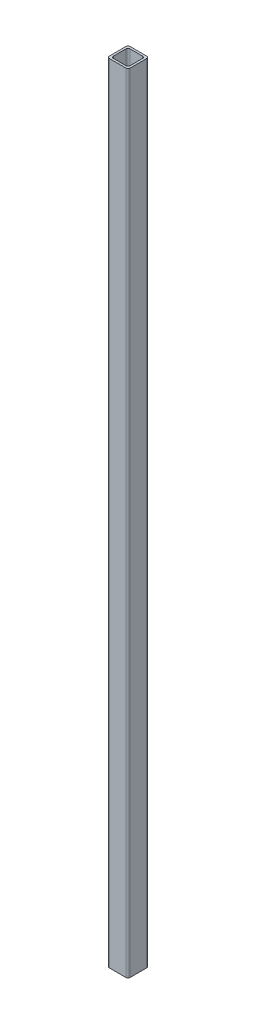
ISO-10303-21;
HEADER;
FILE_DESCRIPTION(('STEP AP214'),'2;1');
FILE_NAME('part.step','',(''),(''),'','','');
FILE_SCHEMA(('AUTOMOTIVE_DESIGN { 1 0 10303 214 1 1 1 1 }'));
ENDSEC;
DATA;
#1=APPLICATION_CONTEXT('core data for automotive mechanical design processes');
#2=APPLICATION_PROTOCOL_DEFINITION('international standard','automotive_design',2000,#1);
#3=PRODUCT_CONTEXT('',#1,'mechanical');
#4=PRODUCT('Part','Part','',(#3));
#5=PRODUCT_RELATED_PRODUCT_CATEGORY('part','',(#4));
#6=PRODUCT_DEFINITION_FORMATION('','',#4);
#7=PRODUCT_DEFINITION_CONTEXT('part definition',#1,'design');
#8=PRODUCT_DEFINITION('design','',#6,#7);
#9=PRODUCT_DEFINITION_SHAPE('','',#8);
#10=(LENGTH_UNIT() NAMED_UNIT(*) SI_UNIT(.MILLI.,.METRE.));
#11=(NAMED_UNIT(*) PLANE_ANGLE_UNIT() SI_UNIT($,.RADIAN.));
#12=(NAMED_UNIT(*) SI_UNIT($,.STERADIAN.) SOLID_ANGLE_UNIT());
#13=UNCERTAINTY_MEASURE_WITH_UNIT(LENGTH_MEASURE(1.E-05),#10,'distance_accuracy_value','');
#14=(GEOMETRIC_REPRESENTATION_CONTEXT(3) GLOBAL_UNCERTAINTY_ASSIGNED_CONTEXT((#13)) GLOBAL_UNIT_ASSIGNED_CONTEXT((#10,
#11,#12)) REPRESENTATION_CONTEXT('',''));
#15=CARTESIAN_POINT('',(0.,0.,0.));
#16=DIRECTION('',(0.,0.,1.));
#17=DIRECTION('',(1.,0.,0.));
#18=AXIS2_PLACEMENT_3D('',#15,#16,#17);
#19=CARTESIAN_POINT('',(-43.8870390225277,-2175.91873492757,2.54345588572199));
#20=DIRECTION('',(0.,-1.,0.));
#21=DIRECTION('',(0.,0.,-1.));
#22=AXIS2_PLACEMENT_3D('',#19,#20,#21);
#23=PLANE('',#22);
#24=DIRECTION('',(1.,0.,0.));
#25=VECTOR('',#24,1.);
#26=CARTESIAN_POINT('',(-49.2861215913166,-2175.91873492757,1.54345588572199));
#27=LINE('',#26,#25);
#28=CARTESIAN_POINT('',(-51.8870390225277,-2175.91873492757,1.54345588572199));
#29=VERTEX_POINT('',#28);
#30=CARTESIAN_POINT('',(-43.8870390225277,-2175.91873492757,1.54345588572199));
#31=VERTEX_POINT('',#30);
#32=EDGE_CURVE('E124',#29,#31,#27,.T.);
#33=ORIENTED_EDGE('',*,*,#32,.F.);
#34=CARTESIAN_POINT('',(-51.8870390225277,-2175.91873492757,2.54345588572199));
#35=DIRECTION('',(0.,-1.,0.));
#36=DIRECTION('',(0.,0.,-1.));
#37=AXIS2_PLACEMENT_3D('',#34,#35,#36);
#38=CIRCLE('',#37,1.);
#39=CARTESIAN_POINT('',(-52.8870390225277,-2175.91873492757,2.54345588572199));
#40=VERTEX_POINT('',#39);
#41=EDGE_CURVE('E145',#40,#29,#38,.T.);
#42=ORIENTED_EDGE('',*,*,#41,.F.);
#43=DIRECTION('',(0.,0.,-1.));
#44=VECTOR('',#43,1.);
#45=CARTESIAN_POINT('',(-52.8870390225277,-2175.91873492757,-2.53911292161383));
#46=LINE('',#45,#44);
#47=CARTESIAN_POINT('',(-52.8870390225277,-2175.91873492757,10.543455885722));
#48=VERTEX_POINT('',#47);
#49=EDGE_CURVE('E142',#48,#40,#46,.T.);
#50=ORIENTED_EDGE('',*,*,#49,.F.);
#51=CARTESIAN_POINT('',(-51.8870390225277,-2175.91873492757,10.543455885722));
#52=DIRECTION('',(0.,-1.,0.));
#53=DIRECTION('',(0.,0.,-1.));
#54=AXIS2_PLACEMENT_3D('',#51,#52,#53);
#55=CIRCLE('',#54,1.);
#56=CARTESIAN_POINT('',(-51.8870390225277,-2175.91873492757,11.543455885722));
#57=VERTEX_POINT('',#56);
#58=EDGE_CURVE('E139',#57,#48,#55,.T.);
#59=ORIENTED_EDGE('',*,*,#58,.F.);
#60=DIRECTION('',(-1.,0.,0.));
#61=VECTOR('',#60,1.);
#62=CARTESIAN_POINT('',(-49.2861215913166,-2175.91873492757,11.543455885722));
#63=LINE('',#62,#61);
#64=CARTESIAN_POINT('',(-43.8870390225277,-2175.91873492757,11.543455885722));
#65=VERTEX_POINT('',#64);
#66=EDGE_CURVE('E136',#65,#57,#63,.T.);
#67=ORIENTED_EDGE('',*,*,#66,.F.);
#68=CARTESIAN_POINT('',(-43.8870390225277,-2175.91873492757,10.543455885722));
#69=DIRECTION('',(0.,-1.,0.));
#70=DIRECTION('',(0.,0.,-1.));
#71=AXIS2_PLACEMENT_3D('',#68,#69,#70);
#72=CIRCLE('',#71,1.);
#73=CARTESIAN_POINT('',(-42.8870390225277,-2175.91873492757,10.543455885722));
#74=VERTEX_POINT('',#73);
#75=EDGE_CURVE('E133',#74,#65,#72,.T.);
#76=ORIENTED_EDGE('',*,*,#75,.F.);
#77=DIRECTION('',(0.,0.,1.));
#78=VECTOR('',#77,1.);
#79=CARTESIAN_POINT('',(-42.8870390225277,-2175.91873492757,-2.53911292161383));
#80=LINE('',#79,#78);
#81=CARTESIAN_POINT('',(-42.8870390225277,-2175.91873492757,2.54345588572199));
#82=VERTEX_POINT('',#81);
#83=EDGE_CURVE('E130',#82,#74,#80,.T.);
#84=ORIENTED_EDGE('',*,*,#83,.F.);
#85=CARTESIAN_POINT('',(-43.8870390225277,-2175.91873492757,2.54345588572199));
#86=DIRECTION('',(0.,-1.,0.));
#87=DIRECTION('',(0.,0.,-1.));
#88=AXIS2_PLACEMENT_3D('',#85,#86,#87);
#89=CIRCLE('',#88,1.);
#90=EDGE_CURVE('E127',#31,#82,#89,.T.);
#91=ORIENTED_EDGE('',*,*,#90,.F.);
#92=EDGE_LOOP('',(#33,#42,#50,#59,#67,#76,#84,#91));
#93=FACE_BOUND('',#92,.T.);
#94=DIRECTION('',(1.,0.,0.));
#95=VECTOR('',#94,1.);
#96=CARTESIAN_POINT('',(-49.2861215913166,-2175.91873492757,2.54345588572199));
#97=LINE('',#96,#95);
#98=CARTESIAN_POINT('',(-50.8870390225277,-2175.91873492757,2.54345588572199));
#99=VERTEX_POINT('',#98);
#100=CARTESIAN_POINT('',(-44.8870390225277,-2175.91873492757,2.54345588572199));
#101=VERTEX_POINT('',#100);
#102=EDGE_CURVE('E262',#99,#101,#97,.T.);
#103=ORIENTED_EDGE('',*,*,#102,.T.);
#104=CARTESIAN_POINT('',(-44.8870390225277,-2175.91873492757,3.54345588572199));
#105=DIRECTION('',(0.,-1.,0.));
#106=DIRECTION('',(0.,0.,-1.));
#107=AXIS2_PLACEMENT_3D('',#104,#105,#106);
#108=CIRCLE('',#107,1.);
#109=CARTESIAN_POINT('',(-43.8870390225277,-2175.91873492757,3.543455885722));
#110=VERTEX_POINT('',#109);
#111=EDGE_CURVE('E322',#101,#110,#108,.T.);
#112=ORIENTED_EDGE('',*,*,#111,.T.);
#113=DIRECTION('',(0.,0.,1.));
#114=VECTOR('',#113,1.);
#115=CARTESIAN_POINT('',(-43.8870390225277,-2175.91873492757,-2.53911292161383));
#116=LINE('',#115,#114);
#117=CARTESIAN_POINT('',(-43.8870390225277,-2175.91873492757,9.54345588572198));
#118=VERTEX_POINT('',#117);
#119=EDGE_CURVE('E301',#110,#118,#116,.T.);
#120=ORIENTED_EDGE('',*,*,#119,.T.);
#121=CARTESIAN_POINT('',(-44.8870390225277,-2175.91873492757,9.54345588572199));
#122=DIRECTION('',(0.,-1.,0.));
#123=DIRECTION('',(0.,0.,-1.));
#124=AXIS2_PLACEMENT_3D('',#121,#122,#123);
#125=CIRCLE('',#124,1.);
#126=CARTESIAN_POINT('',(-44.8870390225277,-2175.91873492757,10.543455885722));
#127=VERTEX_POINT('',#126);
#128=EDGE_CURVE('E112',#118,#127,#125,.T.);
#129=ORIENTED_EDGE('',*,*,#128,.T.);
#130=DIRECTION('',(-1.,0.,0.));
#131=VECTOR('',#130,1.);
#132=CARTESIAN_POINT('',(-49.2861215913166,-2175.91873492757,10.543455885722));
#133=LINE('',#132,#131);
#134=CARTESIAN_POINT('',(-50.8870390225277,-2175.91873492757,10.543455885722));
#135=VERTEX_POINT('',#134);
#136=EDGE_CURVE('E289',#127,#135,#133,.T.);
#137=ORIENTED_EDGE('',*,*,#136,.T.);
#138=CARTESIAN_POINT('',(-50.8870390225277,-2175.91873492757,9.54345588572199));
#139=DIRECTION('',(0.,-1.,0.));
#140=DIRECTION('',(0.,0.,-1.));
#141=AXIS2_PLACEMENT_3D('',#138,#139,#140);
#142=CIRCLE('',#141,1.);
#143=CARTESIAN_POINT('',(-51.8870390225277,-2175.91873492757,9.54345588572198));
#144=VERTEX_POINT('',#143);
#145=EDGE_CURVE('E295',#135,#144,#142,.T.);
#146=ORIENTED_EDGE('',*,*,#145,.T.);
#147=DIRECTION('',(0.,0.,-1.));
#148=VECTOR('',#147,1.);
#149=CARTESIAN_POINT('',(-51.8870390225277,-2175.91873492757,-2.53911292161383));
#150=LINE('',#149,#148);
#151=CARTESIAN_POINT('',(-51.8870390225277,-2175.91873492757,3.543455885722));
#152=VERTEX_POINT('',#151);
#153=EDGE_CURVE('E298',#144,#152,#150,.T.);
#154=ORIENTED_EDGE('',*,*,#153,.T.);
#155=CARTESIAN_POINT('',(-50.8870390225277,-2175.91873492757,3.54345588572199));
#156=DIRECTION('',(0.,-1.,0.));
#157=DIRECTION('',(0.,0.,-1.));
#158=AXIS2_PLACEMENT_3D('',#155,#156,#157);
#159=CIRCLE('',#158,1.);
#160=EDGE_CURVE('E267',#152,#99,#159,.T.);
#161=ORIENTED_EDGE('',*,*,#160,.T.);
#162=EDGE_LOOP('',(#103,#112,#120,#129,#137,#146,#154,#161));
#163=FACE_BOUND('',#162,.T.);
#164=ADVANCED_FACE('F33',(#93,#163),#23,.F.);
#165=CARTESIAN_POINT('',(-49.2861215913166,-2569.3806597059,1.54345588572199));
#166=DIRECTION('',(0.,0.,1.));
#167=DIRECTION('',(1.,0.,0.));
#168=AXIS2_PLACEMENT_3D('',#165,#166,#167);
#169=PLANE('',#168);
#170=DIRECTION('',(0.,1.,0.));
#171=VECTOR('',#170,1.);
#172=CARTESIAN_POINT('',(-43.8870390225277,-2569.3806597059,1.54345588572199));
#173=LINE('',#172,#171);
#174=CARTESIAN_POINT('',(-43.8870390225111,-2555.23852408217,1.54345588571789));
#175=VERTEX_POINT('',#174);
#176=EDGE_CURVE('E169',#175,#31,#173,.T.);
#177=ORIENTED_EDGE('',*,*,#176,.F.);
#178=DIRECTION('',(-1.,0.,0.));
#179=VECTOR('',#178,1.);
#180=CARTESIAN_POINT('',(-49.2861215913166,-2555.23852408217,1.54345588572199));
#181=LINE('',#180,#179);
#182=CARTESIAN_POINT('',(-51.8870390225111,-2555.23852408217,1.54345588571784));
#183=VERTEX_POINT('',#182);
#184=EDGE_CURVE('E11',#175,#183,#181,.T.);
#185=ORIENTED_EDGE('',*,*,#184,.T.);
#186=DIRECTION('',(0.,1.,0.));
#187=VECTOR('',#186,1.);
#188=CARTESIAN_POINT('',(-51.8870390225277,-2569.3806597059,1.54345588572199));
#189=LINE('',#188,#187);
#190=EDGE_CURVE('E148',#183,#29,#189,.T.);
#191=ORIENTED_EDGE('',*,*,#190,.T.);
#192=ORIENTED_EDGE('',*,*,#32,.T.);
#193=EDGE_LOOP('',(#177,#185,#191,#192));
#194=FACE_BOUND('',#193,.T.);
#195=ADVANCED_FACE('F35',(#194),#169,.F.);
#196=CARTESIAN_POINT('',(-43.8870390225277,-2569.3806597059,2.54345588572199));
#197=DIRECTION('',(0.,1.,0.));
#198=DIRECTION('',(0.,0.,1.));
#199=AXIS2_PLACEMENT_3D('',#196,#197,#198);
#200=CYLINDRICAL_SURFACE('',#199,1.);
#201=DIRECTION('',(0.,1.,0.));
#202=VECTOR('',#201,1.);
#203=CARTESIAN_POINT('',(-42.8870390225277,-2569.3806597059,2.54345588572199));
#204=LINE('',#203,#202);
#205=CARTESIAN_POINT('',(-42.8870390225111,-2555.23852408217,2.54345588571789));
#206=VERTEX_POINT('',#205);
#207=EDGE_CURVE('E166',#206,#82,#204,.T.);
#208=ORIENTED_EDGE('',*,*,#207,.F.);
#209=CARTESIAN_POINT('',(-43.8870390225277,-2555.23852408217,2.54345588572199));
#210=DIRECTION('',(0.,1.,0.));
#211=DIRECTION('',(0.,0.,1.));
#212=AXIS2_PLACEMENT_3D('',#209,#210,#211);
#213=CIRCLE('',#212,1.);
#214=EDGE_CURVE('E42',#206,#175,#213,.T.);
#215=ORIENTED_EDGE('',*,*,#214,.T.);
#216=ORIENTED_EDGE('',*,*,#176,.T.);
#217=ORIENTED_EDGE('',*,*,#90,.T.);
#218=EDGE_LOOP('',(#208,#215,#216,#217));
#219=FACE_BOUND('',#218,.T.);
#220=ADVANCED_FACE('F203',(#219),#200,.T.);
#221=CARTESIAN_POINT('',(-42.8870390225277,-2569.3806597059,-2.53911292161383));
#222=DIRECTION('',(-1.,0.,0.));
#223=DIRECTION('',(0.,0.,1.));
#224=AXIS2_PLACEMENT_3D('',#221,#222,#223);
#225=PLANE('',#224);
#226=DIRECTION('',(0.,1.,0.));
#227=VECTOR('',#226,1.);
#228=CARTESIAN_POINT('',(-42.8870390225277,-2569.3806597059,10.543455885722));
#229=LINE('',#228,#227);
#230=CARTESIAN_POINT('',(-42.8870390225111,-2555.23852408217,10.5434558857179));
#231=VERTEX_POINT('',#230);
#232=EDGE_CURVE('E163',#231,#74,#229,.T.);
#233=ORIENTED_EDGE('',*,*,#232,.F.);
#234=DIRECTION('',(0.,0.,-1.));
#235=VECTOR('',#234,1.);
#236=CARTESIAN_POINT('',(-42.8870390225277,-2555.23852408217,-2.53911292161345));
#237=LINE('',#236,#235);
#238=EDGE_CURVE('E198',#231,#206,#237,.T.);
#239=ORIENTED_EDGE('',*,*,#238,.T.);
#240=ORIENTED_EDGE('',*,*,#207,.T.);
#241=ORIENTED_EDGE('',*,*,#83,.T.);
#242=EDGE_LOOP('',(#233,#239,#240,#241));
#243=FACE_BOUND('',#242,.T.);
#244=ADVANCED_FACE('F209',(#243),#225,.F.);
#245=CARTESIAN_POINT('',(-43.8870390225277,-2569.3806597059,10.543455885722));
#246=DIRECTION('',(0.,1.,0.));
#247=DIRECTION('',(0.,0.,1.));
#248=AXIS2_PLACEMENT_3D('',#245,#246,#247);
#249=CYLINDRICAL_SURFACE('',#248,1.);
#250=DIRECTION('',(0.,1.,0.));
#251=VECTOR('',#250,1.);
#252=CARTESIAN_POINT('',(-43.8870390225277,-2569.3806597059,11.543455885722));
#253=LINE('',#252,#251);
#254=CARTESIAN_POINT('',(-43.8870390225111,-2555.23852408217,11.5434558857179));
#255=VERTEX_POINT('',#254);
#256=EDGE_CURVE('E160',#255,#65,#253,.T.);
#257=ORIENTED_EDGE('',*,*,#256,.F.);
#258=CARTESIAN_POINT('',(-43.8870390225277,-2555.23852408217,10.543455885722));
#259=DIRECTION('',(0.,1.,0.));
#260=DIRECTION('',(0.,0.,1.));
#261=AXIS2_PLACEMENT_3D('',#258,#259,#260);
#262=CIRCLE('',#261,1.);
#263=EDGE_CURVE('E195',#255,#231,#262,.T.);
#264=ORIENTED_EDGE('',*,*,#263,.T.);
#265=ORIENTED_EDGE('',*,*,#232,.T.);
#266=ORIENTED_EDGE('',*,*,#75,.T.);
#267=EDGE_LOOP('',(#257,#264,#265,#266));
#268=FACE_BOUND('',#267,.T.);
#269=ADVANCED_FACE('F214',(#268),#249,.T.);
#270=CARTESIAN_POINT('',(-49.2861215913166,-2569.3806597059,11.543455885722));
#271=DIRECTION('',(0.,0.,-1.));
#272=DIRECTION('',(-1.,0.,0.));
#273=AXIS2_PLACEMENT_3D('',#270,#271,#272);
#274=PLANE('',#273);
#275=DIRECTION('',(0.,1.,0.));
#276=VECTOR('',#275,1.);
#277=CARTESIAN_POINT('',(-51.8870390225277,-2569.3806597059,11.543455885722));
#278=LINE('',#277,#276);
#279=CARTESIAN_POINT('',(-51.8870390225111,-2555.23852408217,11.5434558857178));
#280=VERTEX_POINT('',#279);
#281=EDGE_CURVE('E157',#280,#57,#278,.T.);
#282=ORIENTED_EDGE('',*,*,#281,.F.);
#283=DIRECTION('',(1.,0.,0.));
#284=VECTOR('',#283,1.);
#285=CARTESIAN_POINT('',(-49.2861215913166,-2555.23852408217,11.543455885722));
#286=LINE('',#285,#284);
#287=EDGE_CURVE('E192',#280,#255,#286,.T.);
#288=ORIENTED_EDGE('',*,*,#287,.T.);
#289=ORIENTED_EDGE('',*,*,#256,.T.);
#290=ORIENTED_EDGE('',*,*,#66,.T.);
#291=EDGE_LOOP('',(#282,#288,#289,#290));
#292=FACE_BOUND('',#291,.T.);
#293=ADVANCED_FACE('F219',(#292),#274,.F.);
#294=CARTESIAN_POINT('',(-51.8870390225277,-2569.3806597059,10.543455885722));
#295=DIRECTION('',(0.,1.,0.));
#296=DIRECTION('',(0.,0.,1.));
#297=AXIS2_PLACEMENT_3D('',#294,#295,#296);
#298=CYLINDRICAL_SURFACE('',#297,1.);
#299=DIRECTION('',(0.,1.,0.));
#300=VECTOR('',#299,1.);
#301=CARTESIAN_POINT('',(-52.8870390225277,-2569.3806597059,10.543455885722));
#302=LINE('',#301,#300);
#303=CARTESIAN_POINT('',(-52.8870390225111,-2555.23852408217,10.5434558857178));
#304=VERTEX_POINT('',#303);
#305=EDGE_CURVE('E154',#304,#48,#302,.T.);
#306=ORIENTED_EDGE('',*,*,#305,.F.);
#307=CARTESIAN_POINT('',(-51.8870390225277,-2555.23852408217,10.543455885722));
#308=DIRECTION('',(0.,1.,0.));
#309=DIRECTION('',(0.,0.,1.));
#310=AXIS2_PLACEMENT_3D('',#307,#308,#309);
#311=CIRCLE('',#310,1.);
#312=EDGE_CURVE('E189',#304,#280,#311,.T.);
#313=ORIENTED_EDGE('',*,*,#312,.T.);
#314=ORIENTED_EDGE('',*,*,#281,.T.);
#315=ORIENTED_EDGE('',*,*,#58,.T.);
#316=EDGE_LOOP('',(#306,#313,#314,#315));
#317=FACE_BOUND('',#316,.T.);
#318=ADVANCED_FACE('F225',(#317),#298,.T.);
#319=CARTESIAN_POINT('',(-52.8870390225277,-2569.3806597059,-2.53911292161383));
#320=DIRECTION('',(1.,0.,0.));
#321=DIRECTION('',(0.,0.,-1.));
#322=AXIS2_PLACEMENT_3D('',#319,#320,#321);
#323=PLANE('',#322);
#324=DIRECTION('',(0.,1.,0.));
#325=VECTOR('',#324,1.);
#326=CARTESIAN_POINT('',(-52.8870390225277,-2569.3806597059,2.54345588572199));
#327=LINE('',#326,#325);
#328=CARTESIAN_POINT('',(-52.8870390225277,-2555.23852408217,2.54345588572199));
#329=VERTEX_POINT('',#328);
#330=EDGE_CURVE('E151',#329,#40,#327,.T.);
#331=ORIENTED_EDGE('',*,*,#330,.F.);
#332=DIRECTION('',(0.,0.,1.));
#333=VECTOR('',#332,1.);
#334=CARTESIAN_POINT('',(-52.8870390225277,-2555.23852408217,-2.53911292161345));
#335=LINE('',#334,#333);
#336=EDGE_CURVE('E175',#329,#304,#335,.T.);
#337=ORIENTED_EDGE('',*,*,#336,.T.);
#338=ORIENTED_EDGE('',*,*,#305,.T.);
#339=ORIENTED_EDGE('',*,*,#49,.T.);
#340=EDGE_LOOP('',(#331,#337,#338,#339));
#341=FACE_BOUND('',#340,.T.);
#342=ADVANCED_FACE('F230',(#341),#323,.F.);
#343=CARTESIAN_POINT('',(-51.8870390225277,-2569.3806597059,2.54345588572199));
#344=DIRECTION('',(0.,1.,0.));
#345=DIRECTION('',(0.,0.,1.));
#346=AXIS2_PLACEMENT_3D('',#343,#344,#345);
#347=CYLINDRICAL_SURFACE('',#346,1.);
#348=ORIENTED_EDGE('',*,*,#190,.F.);
#349=CARTESIAN_POINT('',(-51.8870390225277,-2555.23852408217,2.54345588572199));
#350=DIRECTION('',(0.,1.,0.));
#351=DIRECTION('',(0.,0.,1.));
#352=AXIS2_PLACEMENT_3D('',#349,#350,#351);
#353=CIRCLE('',#352,1.);
#354=EDGE_CURVE('E176',#183,#329,#353,.T.);
#355=ORIENTED_EDGE('',*,*,#354,.T.);
#356=ORIENTED_EDGE('',*,*,#330,.T.);
#357=ORIENTED_EDGE('',*,*,#41,.T.);
#358=EDGE_LOOP('',(#348,#355,#356,#357));
#359=FACE_BOUND('',#358,.T.);
#360=ADVANCED_FACE('F236',(#359),#347,.T.);
#361=CARTESIAN_POINT('',(-49.2861215913166,-2569.3806597059,2.54345588572199));
#362=DIRECTION('',(0.,0.,1.));
#363=DIRECTION('',(1.,0.,0.));
#364=AXIS2_PLACEMENT_3D('',#361,#362,#363);
#365=PLANE('',#364);
#366=DIRECTION('',(-1.,0.,0.));
#367=VECTOR('',#366,1.);
#368=CARTESIAN_POINT('',(-49.2861215913166,-2555.23852408217,2.54345588572199));
#369=LINE('',#368,#367);
#370=CARTESIAN_POINT('',(-44.8870390225111,-2555.23852408217,2.54345588571788));
#371=VERTEX_POINT('',#370);
#372=CARTESIAN_POINT('',(-50.8870390225277,-2555.23852408217,2.54345588572199));
#373=VERTEX_POINT('',#372);
#374=EDGE_CURVE('E182',#371,#373,#369,.T.);
#375=ORIENTED_EDGE('',*,*,#374,.F.);
#376=DIRECTION('',(0.,1.,0.));
#377=VECTOR('',#376,1.);
#378=CARTESIAN_POINT('',(-44.8870390225277,-2569.3806597059,2.54345588572199));
#379=LINE('',#378,#377);
#380=EDGE_CURVE('E116',#371,#101,#379,.T.);
#381=ORIENTED_EDGE('',*,*,#380,.T.);
#382=ORIENTED_EDGE('',*,*,#102,.F.);
#383=DIRECTION('',(0.,1.,0.));
#384=VECTOR('',#383,1.);
#385=CARTESIAN_POINT('',(-50.8870390225277,-2569.3806597059,2.54345588572199));
#386=LINE('',#385,#384);
#387=EDGE_CURVE('E259',#373,#99,#386,.T.);
#388=ORIENTED_EDGE('',*,*,#387,.F.);
#389=EDGE_LOOP('',(#375,#381,#382,#388));
#390=FACE_BOUND('',#389,.T.);
#391=ADVANCED_FACE('F260',(#390),#365,.T.);
#392=CARTESIAN_POINT('',(-44.8870390225277,-2569.3806597059,3.54345588572199));
#393=DIRECTION('',(0.,1.,0.));
#394=DIRECTION('',(0.,0.,1.));
#395=AXIS2_PLACEMENT_3D('',#392,#393,#394);
#396=CYLINDRICAL_SURFACE('',#395,1.);
#397=CARTESIAN_POINT('',(-44.8870390225277,-2555.23852408217,3.54345588572199));
#398=DIRECTION('',(0.,1.,0.));
#399=DIRECTION('',(0.,0.,1.));
#400=AXIS2_PLACEMENT_3D('',#397,#398,#399);
#401=CIRCLE('',#400,1.);
#402=CARTESIAN_POINT('',(-43.8870390225111,-2555.23852408217,3.54345588571789));
#403=VERTEX_POINT('',#402);
#404=EDGE_CURVE('E108',#403,#371,#401,.T.);
#405=ORIENTED_EDGE('',*,*,#404,.F.);
#406=DIRECTION('',(0.,1.,0.));
#407=VECTOR('',#406,1.);
#408=CARTESIAN_POINT('',(-43.8870390225277,-2569.3806597059,3.543455885722));
#409=LINE('',#408,#407);
#410=EDGE_CURVE('E107',#403,#110,#409,.T.);
#411=ORIENTED_EDGE('',*,*,#410,.T.);
#412=ORIENTED_EDGE('',*,*,#111,.F.);
#413=ORIENTED_EDGE('',*,*,#380,.F.);
#414=EDGE_LOOP('',(#405,#411,#412,#413));
#415=FACE_BOUND('',#414,.T.);
#416=ADVANCED_FACE('F323',(#415),#396,.F.);
#417=CARTESIAN_POINT('',(-43.8870390225277,-2569.3806597059,-2.53911292161383));
#418=DIRECTION('',(-1.,0.,0.));
#419=DIRECTION('',(0.,0.,1.));
#420=AXIS2_PLACEMENT_3D('',#417,#418,#419);
#421=PLANE('',#420);
#422=DIRECTION('',(0.,0.,-1.));
#423=VECTOR('',#422,1.);
#424=CARTESIAN_POINT('',(-43.8870390225277,-2555.23852408217,-2.53911292161345));
#425=LINE('',#424,#423);
#426=CARTESIAN_POINT('',(-43.8870390225111,-2555.23852408217,9.54345588571789));
#427=VERTEX_POINT('',#426);
#428=EDGE_CURVE('E91',#427,#403,#425,.T.);
#429=ORIENTED_EDGE('',*,*,#428,.F.);
#430=DIRECTION('',(0.,1.,0.));
#431=VECTOR('',#430,1.);
#432=CARTESIAN_POINT('',(-43.8870390225277,-2569.3806597059,9.54345588572198));
#433=LINE('',#432,#431);
#434=EDGE_CURVE('E104',#427,#118,#433,.T.);
#435=ORIENTED_EDGE('',*,*,#434,.T.);
#436=ORIENTED_EDGE('',*,*,#119,.F.);
#437=ORIENTED_EDGE('',*,*,#410,.F.);
#438=EDGE_LOOP('',(#429,#435,#436,#437));
#439=FACE_BOUND('',#438,.T.);
#440=ADVANCED_FACE('F101',(#439),#421,.T.);
#441=CARTESIAN_POINT('',(-44.8870390225277,-2569.3806597059,9.54345588572199));
#442=DIRECTION('',(0.,1.,0.));
#443=DIRECTION('',(0.,0.,1.));
#444=AXIS2_PLACEMENT_3D('',#441,#442,#443);
#445=CYLINDRICAL_SURFACE('',#444,1.);
#446=CARTESIAN_POINT('',(-44.8870390225277,-2555.23852408217,9.54345588572199));
#447=DIRECTION('',(0.,1.,0.));
#448=DIRECTION('',(0.,0.,1.));
#449=AXIS2_PLACEMENT_3D('',#446,#447,#448);
#450=CIRCLE('',#449,1.);
#451=CARTESIAN_POINT('',(-44.8870390225111,-2555.23852408217,10.5434558857179));
#452=VERTEX_POINT('',#451);
#453=EDGE_CURVE('E87',#452,#427,#450,.T.);
#454=ORIENTED_EDGE('',*,*,#453,.F.);
#455=DIRECTION('',(0.,1.,0.));
#456=VECTOR('',#455,1.);
#457=CARTESIAN_POINT('',(-44.8870390225277,-2569.3806597059,10.543455885722));
#458=LINE('',#457,#456);
#459=EDGE_CURVE('E114',#452,#127,#458,.T.);
#460=ORIENTED_EDGE('',*,*,#459,.T.);
#461=ORIENTED_EDGE('',*,*,#128,.F.);
#462=ORIENTED_EDGE('',*,*,#434,.F.);
#463=EDGE_LOOP('',(#454,#460,#461,#462));
#464=FACE_BOUND('',#463,.T.);
#465=ADVANCED_FACE('F110',(#464),#445,.F.);
#466=CARTESIAN_POINT('',(-49.2861215913166,-2569.3806597059,10.543455885722));
#467=DIRECTION('',(0.,0.,-1.));
#468=DIRECTION('',(-1.,0.,0.));
#469=AXIS2_PLACEMENT_3D('',#466,#467,#468);
#470=PLANE('',#469);
#471=DIRECTION('',(1.,0.,0.));
#472=VECTOR('',#471,1.);
#473=CARTESIAN_POINT('',(-49.2861215913166,-2555.23852408217,10.543455885722));
#474=LINE('',#473,#472);
#475=CARTESIAN_POINT('',(-50.8870390225111,-2555.23852408217,10.5434558857178));
#476=VERTEX_POINT('',#475);
#477=EDGE_CURVE('E85',#476,#452,#474,.T.);
#478=ORIENTED_EDGE('',*,*,#477,.F.);
#479=DIRECTION('',(0.,1.,0.));
#480=VECTOR('',#479,1.);
#481=CARTESIAN_POINT('',(-50.8870390225277,-2569.3806597059,10.543455885722));
#482=LINE('',#481,#480);
#483=EDGE_CURVE('E118',#476,#135,#482,.T.);
#484=ORIENTED_EDGE('',*,*,#483,.T.);
#485=ORIENTED_EDGE('',*,*,#136,.F.);
#486=ORIENTED_EDGE('',*,*,#459,.F.);
#487=EDGE_LOOP('',(#478,#484,#485,#486));
#488=FACE_BOUND('',#487,.T.);
#489=ADVANCED_FACE('F286',(#488),#470,.T.);
#490=CARTESIAN_POINT('',(-50.8870390225277,-2569.3806597059,9.54345588572199));
#491=DIRECTION('',(0.,1.,0.));
#492=DIRECTION('',(0.,0.,1.));
#493=AXIS2_PLACEMENT_3D('',#490,#491,#492);
#494=CYLINDRICAL_SURFACE('',#493,1.);
#495=CARTESIAN_POINT('',(-50.8870390225277,-2555.23852408217,9.54345588572199));
#496=DIRECTION('',(0.,1.,0.));
#497=DIRECTION('',(0.,0.,1.));
#498=AXIS2_PLACEMENT_3D('',#495,#496,#497);
#499=CIRCLE('',#498,1.);
#500=CARTESIAN_POINT('',(-51.8870390225111,-2555.23852408217,9.54345588571784));
#501=VERTEX_POINT('',#500);
#502=EDGE_CURVE('E178',#501,#476,#499,.T.);
#503=ORIENTED_EDGE('',*,*,#502,.F.);
#504=DIRECTION('',(0.,1.,0.));
#505=VECTOR('',#504,1.);
#506=CARTESIAN_POINT('',(-51.8870390225277,-2569.3806597059,9.54345588572198));
#507=LINE('',#506,#505);
#508=EDGE_CURVE('E275',#501,#144,#507,.T.);
#509=ORIENTED_EDGE('',*,*,#508,.T.);
#510=ORIENTED_EDGE('',*,*,#145,.F.);
#511=ORIENTED_EDGE('',*,*,#483,.F.);
#512=EDGE_LOOP('',(#503,#509,#510,#511));
#513=FACE_BOUND('',#512,.T.);
#514=ADVANCED_FACE('F296',(#513),#494,.F.);
#515=CARTESIAN_POINT('',(-51.8870390225277,-2569.3806597059,-2.53911292161383));
#516=DIRECTION('',(1.,0.,0.));
#517=DIRECTION('',(0.,0.,-1.));
#518=AXIS2_PLACEMENT_3D('',#515,#516,#517);
#519=PLANE('',#518);
#520=DIRECTION('',(0.,0.,1.));
#521=VECTOR('',#520,1.);
#522=CARTESIAN_POINT('',(-51.8870390225277,-2555.23852408217,-2.53911292161345));
#523=LINE('',#522,#521);
#524=CARTESIAN_POINT('',(-51.8870390225111,-2555.23852408217,3.54345588571784));
#525=VERTEX_POINT('',#524);
#526=EDGE_CURVE('E172',#525,#501,#523,.T.);
#527=ORIENTED_EDGE('',*,*,#526,.F.);
#528=DIRECTION('',(0.,1.,0.));
#529=VECTOR('',#528,1.);
#530=CARTESIAN_POINT('',(-51.8870390225277,-2569.3806597059,3.543455885722));
#531=LINE('',#530,#529);
#532=EDGE_CURVE('E266',#525,#152,#531,.T.);
#533=ORIENTED_EDGE('',*,*,#532,.T.);
#534=ORIENTED_EDGE('',*,*,#153,.F.);
#535=ORIENTED_EDGE('',*,*,#508,.F.);
#536=EDGE_LOOP('',(#527,#533,#534,#535));
#537=FACE_BOUND('',#536,.T.);
#538=ADVANCED_FACE('F308',(#537),#519,.T.);
#539=CARTESIAN_POINT('',(-50.8870390225277,-2569.3806597059,3.54345588572199));
#540=DIRECTION('',(0.,1.,0.));
#541=DIRECTION('',(0.,0.,1.));
#542=AXIS2_PLACEMENT_3D('',#539,#540,#541);
#543=CYLINDRICAL_SURFACE('',#542,1.);
#544=CARTESIAN_POINT('',(-50.8870390225277,-2555.23852408217,3.54345588572199));
#545=DIRECTION('',(0.,1.,0.));
#546=DIRECTION('',(0.,0.,1.));
#547=AXIS2_PLACEMENT_3D('',#544,#545,#546);
#548=CIRCLE('',#547,1.);
#549=EDGE_CURVE('E173',#373,#525,#548,.T.);
#550=ORIENTED_EDGE('',*,*,#549,.F.);
#551=ORIENTED_EDGE('',*,*,#387,.T.);
#552=ORIENTED_EDGE('',*,*,#160,.F.);
#553=ORIENTED_EDGE('',*,*,#532,.F.);
#554=EDGE_LOOP('',(#550,#551,#552,#553));
#555=FACE_BOUND('',#554,.T.);
#556=ADVANCED_FACE('F270',(#555),#543,.F.);
#557=CARTESIAN_POINT('',(-56.9696078298505,-2555.23852408217,5.14437331691048));
#558=DIRECTION('',(0.,1.,0.));
#559=DIRECTION('',(-1.,0.,0.));
#560=AXIS2_PLACEMENT_3D('',#557,#558,#559);
#561=PLANE('',#560);
#562=ORIENTED_EDGE('',*,*,#428,.T.);
#563=ORIENTED_EDGE('',*,*,#404,.T.);
#564=ORIENTED_EDGE('',*,*,#374,.T.);
#565=ORIENTED_EDGE('',*,*,#549,.T.);
#566=ORIENTED_EDGE('',*,*,#526,.T.);
#567=ORIENTED_EDGE('',*,*,#502,.T.);
#568=ORIENTED_EDGE('',*,*,#477,.T.);
#569=ORIENTED_EDGE('',*,*,#453,.T.);
#570=EDGE_LOOP('',(#562,#563,#564,#565,#566,#567,#568,#569));
#571=FACE_BOUND('',#570,.T.);
#572=ORIENTED_EDGE('',*,*,#184,.F.);
#573=ORIENTED_EDGE('',*,*,#214,.F.);
#574=ORIENTED_EDGE('',*,*,#238,.F.);
#575=ORIENTED_EDGE('',*,*,#263,.F.);
#576=ORIENTED_EDGE('',*,*,#287,.F.);
#577=ORIENTED_EDGE('',*,*,#312,.F.);
#578=ORIENTED_EDGE('',*,*,#336,.F.);
#579=ORIENTED_EDGE('',*,*,#354,.F.);
#580=EDGE_LOOP('',(#572,#573,#574,#575,#576,#577,#578,#579));
#581=FACE_BOUND('',#580,.T.);
#582=ADVANCED_FACE('F89',(#571,#581),#561,.F.);
#583=CLOSED_SHELL('',(#164,#195,#220,#244,#269,#293,#318,#342,#360,#391,#416,#440,#465,#489,
#514,#538,#556,#582));
#584=MANIFOLD_SOLID_BREP('B2',#583);
#585=ADVANCED_BREP_SHAPE_REPRESENTATION('',(#18,#584),#14);
#586=SHAPE_DEFINITION_REPRESENTATION(#9,#585);
ENDSEC;
END-ISO-10303-21;
